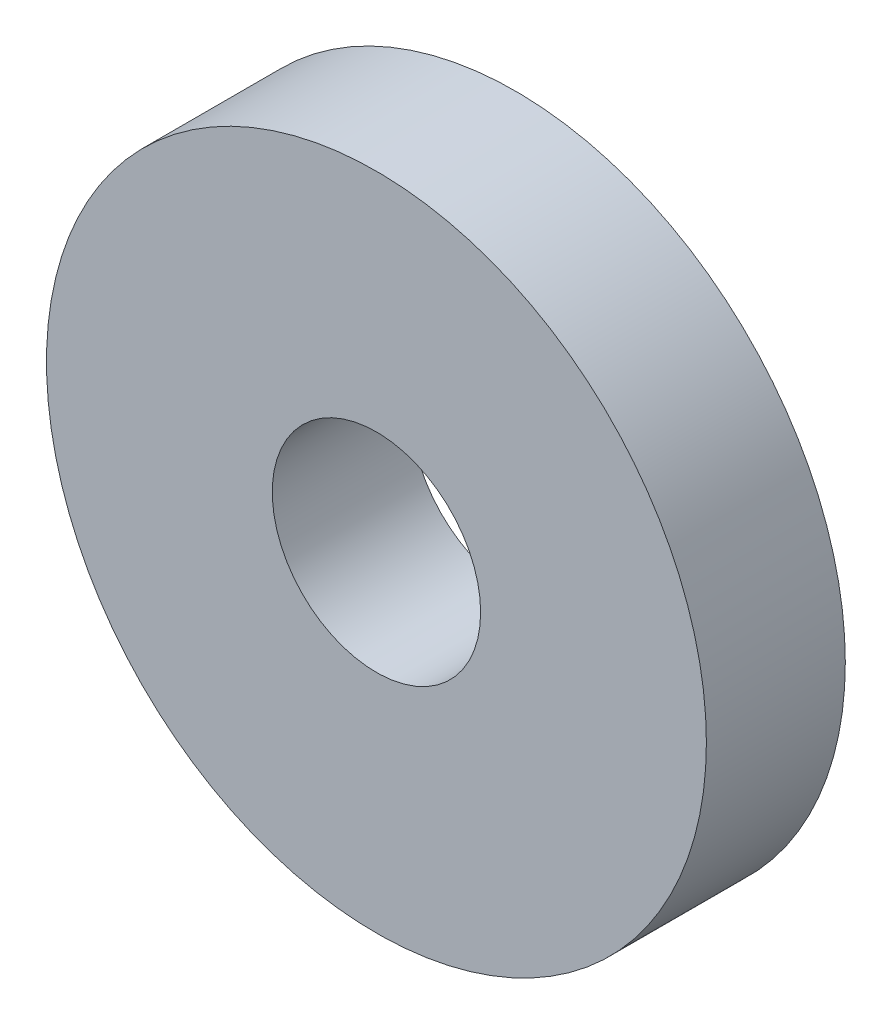
ISO-10303-21;
HEADER;
FILE_DESCRIPTION(('STEP AP214'),'2;1');
FILE_NAME('part.step','',(''),(''),'','','');
FILE_SCHEMA(('AUTOMOTIVE_DESIGN { 1 0 10303 214 1 1 1 1 }'));
ENDSEC;
DATA;
#1=APPLICATION_CONTEXT('core data for automotive mechanical design processes');
#2=APPLICATION_PROTOCOL_DEFINITION('international standard','automotive_design',2000,#1);
#3=PRODUCT_CONTEXT('',#1,'mechanical');
#4=PRODUCT('Part','Part','',(#3));
#5=PRODUCT_RELATED_PRODUCT_CATEGORY('part','',(#4));
#6=PRODUCT_DEFINITION_FORMATION('','',#4);
#7=PRODUCT_DEFINITION_CONTEXT('part definition',#1,'design');
#8=PRODUCT_DEFINITION('design','',#6,#7);
#9=PRODUCT_DEFINITION_SHAPE('','',#8);
#10=(LENGTH_UNIT() NAMED_UNIT(*) SI_UNIT(.MILLI.,.METRE.));
#11=(NAMED_UNIT(*) PLANE_ANGLE_UNIT() SI_UNIT($,.RADIAN.));
#12=(NAMED_UNIT(*) SI_UNIT($,.STERADIAN.) SOLID_ANGLE_UNIT());
#13=UNCERTAINTY_MEASURE_WITH_UNIT(LENGTH_MEASURE(1.E-05),#10,'distance_accuracy_value','');
#14=(GEOMETRIC_REPRESENTATION_CONTEXT(3) GLOBAL_UNCERTAINTY_ASSIGNED_CONTEXT((#13)) GLOBAL_UNIT_ASSIGNED_CONTEXT((#10,
#11,#12)) REPRESENTATION_CONTEXT('',''));
#15=CARTESIAN_POINT('',(0.,0.,0.));
#16=DIRECTION('',(0.,0.,1.));
#17=DIRECTION('',(1.,0.,0.));
#18=AXIS2_PLACEMENT_3D('',#15,#16,#17);
#19=CARTESIAN_POINT('',(0.,0.,4.));
#20=DIRECTION('',(0.,0.,1.));
#21=DIRECTION('',(1.,0.,0.));
#22=AXIS2_PLACEMENT_3D('',#19,#20,#21);
#23=PLANE('',#22);
#24=CARTESIAN_POINT('',(0.,0.,4.));
#25=DIRECTION('',(0.,0.,1.));
#26=DIRECTION('',(1.,0.,0.));
#27=AXIS2_PLACEMENT_3D('',#24,#25,#26);
#28=CIRCLE('',#27,9.5);
#29=CARTESIAN_POINT('',(9.5,0.,4.));
#30=VERTEX_POINT('',#29);
#31=EDGE_CURVE('E10',#30,#30,#28,.T.);
#32=ORIENTED_EDGE('',*,*,#31,.T.);
#33=EDGE_LOOP('',(#32));
#34=FACE_BOUND('',#33,.T.);
#35=CARTESIAN_POINT('',(0.,0.,4.));
#36=DIRECTION('',(0.,0.,1.));
#37=DIRECTION('',(1.,0.,0.));
#38=AXIS2_PLACEMENT_3D('',#35,#36,#37);
#39=CIRCLE('',#38,3.);
#40=CARTESIAN_POINT('',(3.,0.,4.));
#41=VERTEX_POINT('',#40);
#42=EDGE_CURVE('E52',#41,#41,#39,.T.);
#43=ORIENTED_EDGE('',*,*,#42,.F.);
#44=EDGE_LOOP('',(#43));
#45=FACE_BOUND('',#44,.T.);
#46=ADVANCED_FACE('F41',(#34,#45),#23,.T.);
#47=CARTESIAN_POINT('',(0.,0.,0.));
#48=DIRECTION('',(0.,0.,1.));
#49=DIRECTION('',(1.,0.,0.));
#50=AXIS2_PLACEMENT_3D('',#47,#48,#49);
#51=PLANE('',#50);
#52=CARTESIAN_POINT('',(0.,0.,0.));
#53=DIRECTION('',(0.,0.,1.));
#54=DIRECTION('',(1.,0.,0.));
#55=AXIS2_PLACEMENT_3D('',#52,#53,#54);
#56=CIRCLE('',#55,9.5);
#57=CARTESIAN_POINT('',(9.5,0.,0.));
#58=VERTEX_POINT('',#57);
#59=EDGE_CURVE('E45',#58,#58,#56,.T.);
#60=ORIENTED_EDGE('',*,*,#59,.F.);
#61=EDGE_LOOP('',(#60));
#62=FACE_BOUND('',#61,.T.);
#63=CARTESIAN_POINT('',(0.,0.,0.));
#64=DIRECTION('',(0.,0.,1.));
#65=DIRECTION('',(1.,0.,0.));
#66=AXIS2_PLACEMENT_3D('',#63,#64,#65);
#67=CIRCLE('',#66,3.);
#68=CARTESIAN_POINT('',(3.,0.,0.));
#69=VERTEX_POINT('',#68);
#70=EDGE_CURVE('E54',#69,#69,#67,.T.);
#71=ORIENTED_EDGE('',*,*,#70,.T.);
#72=EDGE_LOOP('',(#71));
#73=FACE_BOUND('',#72,.T.);
#74=ADVANCED_FACE('F64',(#62,#73),#51,.F.);
#75=CARTESIAN_POINT('',(0.,0.,4.));
#76=DIRECTION('',(0.,0.,-1.));
#77=DIRECTION('',(-1.,0.,0.));
#78=AXIS2_PLACEMENT_3D('',#75,#76,#77);
#79=CYLINDRICAL_SURFACE('',#78,9.5);
#80=ORIENTED_EDGE('',*,*,#31,.F.);
#81=EDGE_LOOP('',(#80));
#82=FACE_BOUND('',#81,.T.);
#83=ORIENTED_EDGE('',*,*,#59,.T.);
#84=EDGE_LOOP('',(#83));
#85=FACE_BOUND('',#84,.T.);
#86=ADVANCED_FACE('F43',(#82,#85),#79,.T.);
#87=CARTESIAN_POINT('',(0.,0.,4.));
#88=DIRECTION('',(0.,0.,-1.));
#89=DIRECTION('',(-1.,0.,0.));
#90=AXIS2_PLACEMENT_3D('',#87,#88,#89);
#91=CYLINDRICAL_SURFACE('',#90,3.);
#92=ORIENTED_EDGE('',*,*,#42,.T.);
#93=EDGE_LOOP('',(#92));
#94=FACE_BOUND('',#93,.T.);
#95=ORIENTED_EDGE('',*,*,#70,.F.);
#96=EDGE_LOOP('',(#95));
#97=FACE_BOUND('',#96,.T.);
#98=ADVANCED_FACE('F60',(#94,#97),#91,.F.);
#99=CLOSED_SHELL('',(#46,#74,#86,#98));
#100=MANIFOLD_SOLID_BREP('B2',#99);
#101=ADVANCED_BREP_SHAPE_REPRESENTATION('',(#18,#100),#14);
#102=SHAPE_DEFINITION_REPRESENTATION(#9,#101);
ENDSEC;
END-ISO-10303-21;
